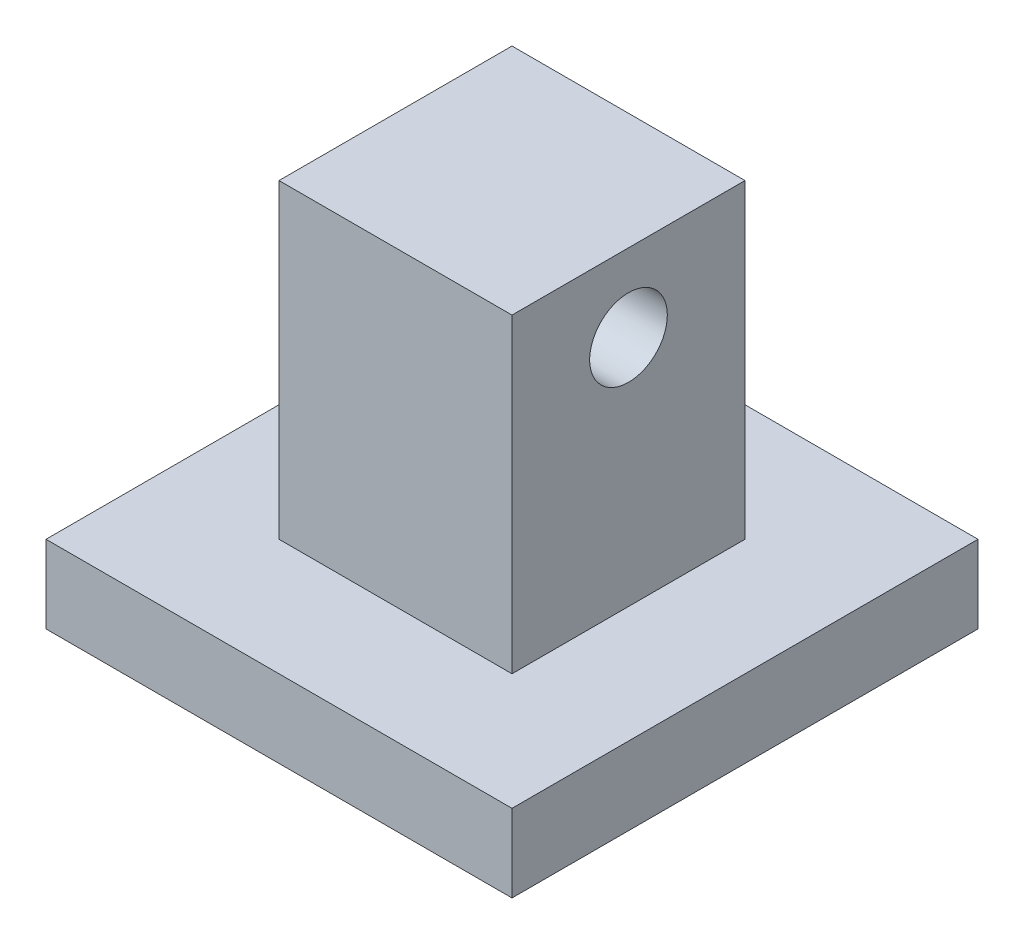
ISO-10303-21;
HEADER;
FILE_DESCRIPTION(('STEP AP214'),'2;1');
FILE_NAME('part.step','',(''),(''),'','','');
FILE_SCHEMA(('AUTOMOTIVE_DESIGN { 1 0 10303 214 1 1 1 1 }'));
ENDSEC;
DATA;
#1=APPLICATION_CONTEXT('core data for automotive mechanical design processes');
#2=APPLICATION_PROTOCOL_DEFINITION('international standard','automotive_design',2000,#1);
#3=PRODUCT_CONTEXT('',#1,'mechanical');
#4=PRODUCT('Part','Part','',(#3));
#5=PRODUCT_RELATED_PRODUCT_CATEGORY('part','',(#4));
#6=PRODUCT_DEFINITION_FORMATION('','',#4);
#7=PRODUCT_DEFINITION_CONTEXT('part definition',#1,'design');
#8=PRODUCT_DEFINITION('design','',#6,#7);
#9=PRODUCT_DEFINITION_SHAPE('','',#8);
#10=(LENGTH_UNIT() NAMED_UNIT(*) SI_UNIT(.MILLI.,.METRE.));
#11=(NAMED_UNIT(*) PLANE_ANGLE_UNIT() SI_UNIT($,.RADIAN.));
#12=(NAMED_UNIT(*) SI_UNIT($,.STERADIAN.) SOLID_ANGLE_UNIT());
#13=UNCERTAINTY_MEASURE_WITH_UNIT(LENGTH_MEASURE(1.E-05),#10,'distance_accuracy_value','');
#14=(GEOMETRIC_REPRESENTATION_CONTEXT(3) GLOBAL_UNCERTAINTY_ASSIGNED_CONTEXT((#13)) GLOBAL_UNIT_ASSIGNED_CONTEXT((#10,
#11,#12)) REPRESENTATION_CONTEXT('',''));
#15=CARTESIAN_POINT('',(0.,0.,0.));
#16=DIRECTION('',(0.,0.,1.));
#17=DIRECTION('',(1.,0.,0.));
#18=AXIS2_PLACEMENT_3D('',#15,#16,#17);
#19=CARTESIAN_POINT('',(76.2,25.4,-76.2));
#20=DIRECTION('',(-1.,0.,0.));
#21=DIRECTION('',(0.,0.,1.));
#22=AXIS2_PLACEMENT_3D('',#19,#20,#21);
#23=PLANE('',#22);
#24=DIRECTION('',(0.,0.,-1.));
#25=VECTOR('',#24,1.);
#26=CARTESIAN_POINT('',(76.2,0.,-76.2));
#27=LINE('',#26,#25);
#28=CARTESIAN_POINT('',(76.2,0.,76.2));
#29=VERTEX_POINT('',#28);
#30=CARTESIAN_POINT('',(76.2,0.,-76.2));
#31=VERTEX_POINT('',#30);
#32=EDGE_CURVE('E127',#29,#31,#27,.T.);
#33=ORIENTED_EDGE('',*,*,#32,.T.);
#34=DIRECTION('',(0.,-1.,0.));
#35=VECTOR('',#34,1.);
#36=CARTESIAN_POINT('',(76.2,25.4,-76.2));
#37=LINE('',#36,#35);
#38=CARTESIAN_POINT('',(76.2,25.4,-76.2));
#39=VERTEX_POINT('',#38);
#40=EDGE_CURVE('E11',#39,#31,#37,.T.);
#41=ORIENTED_EDGE('',*,*,#40,.F.);
#42=DIRECTION('',(0.,0.,-1.));
#43=VECTOR('',#42,1.);
#44=CARTESIAN_POINT('',(76.2,25.4,-76.2));
#45=LINE('',#44,#43);
#46=CARTESIAN_POINT('',(76.2,25.4,76.2));
#47=VERTEX_POINT('',#46);
#48=EDGE_CURVE('E138',#47,#39,#45,.T.);
#49=ORIENTED_EDGE('',*,*,#48,.F.);
#50=DIRECTION('',(0.,-1.,0.));
#51=VECTOR('',#50,1.);
#52=CARTESIAN_POINT('',(76.2,25.4,76.2));
#53=LINE('',#52,#51);
#54=EDGE_CURVE('E151',#47,#29,#53,.T.);
#55=ORIENTED_EDGE('',*,*,#54,.T.);
#56=EDGE_LOOP('',(#33,#41,#49,#55));
#57=FACE_BOUND('',#56,.T.);
#58=ADVANCED_FACE('F39',(#57),#23,.F.);
#59=CARTESIAN_POINT('',(-76.2,25.4,-76.2));
#60=DIRECTION('',(0.,0.,1.));
#61=DIRECTION('',(1.,0.,0.));
#62=AXIS2_PLACEMENT_3D('',#59,#60,#61);
#63=PLANE('',#62);
#64=DIRECTION('',(-1.,0.,0.));
#65=VECTOR('',#64,1.);
#66=CARTESIAN_POINT('',(-76.2,0.,-76.2));
#67=LINE('',#66,#65);
#68=CARTESIAN_POINT('',(-76.2,0.,-76.2));
#69=VERTEX_POINT('',#68);
#70=EDGE_CURVE('E132',#31,#69,#67,.T.);
#71=ORIENTED_EDGE('',*,*,#70,.T.);
#72=DIRECTION('',(0.,-1.,0.));
#73=VECTOR('',#72,1.);
#74=CARTESIAN_POINT('',(-76.2,25.4,-76.2));
#75=LINE('',#74,#73);
#76=CARTESIAN_POINT('',(-76.2,25.4,-76.2));
#77=VERTEX_POINT('',#76);
#78=EDGE_CURVE('E47',#77,#69,#75,.T.);
#79=ORIENTED_EDGE('',*,*,#78,.F.);
#80=DIRECTION('',(-1.,0.,0.));
#81=VECTOR('',#80,1.);
#82=CARTESIAN_POINT('',(-76.2,25.4,-76.2));
#83=LINE('',#82,#81);
#84=EDGE_CURVE('E142',#39,#77,#83,.T.);
#85=ORIENTED_EDGE('',*,*,#84,.F.);
#86=ORIENTED_EDGE('',*,*,#40,.T.);
#87=EDGE_LOOP('',(#71,#79,#85,#86));
#88=FACE_BOUND('',#87,.T.);
#89=ADVANCED_FACE('F188',(#88),#63,.F.);
#90=CARTESIAN_POINT('',(-76.2,25.4,-76.2));
#91=DIRECTION('',(1.,0.,0.));
#92=DIRECTION('',(0.,0.,-1.));
#93=AXIS2_PLACEMENT_3D('',#90,#91,#92);
#94=PLANE('',#93);
#95=DIRECTION('',(0.,0.,1.));
#96=VECTOR('',#95,1.);
#97=CARTESIAN_POINT('',(-76.2,0.,-76.2));
#98=LINE('',#97,#96);
#99=CARTESIAN_POINT('',(-76.2,0.,76.2));
#100=VERTEX_POINT('',#99);
#101=EDGE_CURVE('E155',#69,#100,#98,.T.);
#102=ORIENTED_EDGE('',*,*,#101,.T.);
#103=DIRECTION('',(0.,-1.,0.));
#104=VECTOR('',#103,1.);
#105=CARTESIAN_POINT('',(-76.2,25.4,76.2));
#106=LINE('',#105,#104);
#107=CARTESIAN_POINT('',(-76.2,25.4,76.2));
#108=VERTEX_POINT('',#107);
#109=EDGE_CURVE('E163',#108,#100,#106,.T.);
#110=ORIENTED_EDGE('',*,*,#109,.F.);
#111=DIRECTION('',(0.,0.,1.));
#112=VECTOR('',#111,1.);
#113=CARTESIAN_POINT('',(-76.2,25.4,-76.2));
#114=LINE('',#113,#112);
#115=EDGE_CURVE('E146',#77,#108,#114,.T.);
#116=ORIENTED_EDGE('',*,*,#115,.F.);
#117=ORIENTED_EDGE('',*,*,#78,.T.);
#118=EDGE_LOOP('',(#102,#110,#116,#117));
#119=FACE_BOUND('',#118,.T.);
#120=ADVANCED_FACE('F172',(#119),#94,.F.);
#121=CARTESIAN_POINT('',(-76.2,25.4,76.2));
#122=DIRECTION('',(0.,0.,-1.));
#123=DIRECTION('',(-1.,0.,0.));
#124=AXIS2_PLACEMENT_3D('',#121,#122,#123);
#125=PLANE('',#124);
#126=DIRECTION('',(1.,0.,0.));
#127=VECTOR('',#126,1.);
#128=CARTESIAN_POINT('',(-76.2,0.,76.2));
#129=LINE('',#128,#127);
#130=EDGE_CURVE('E143',#100,#29,#129,.T.);
#131=ORIENTED_EDGE('',*,*,#130,.T.);
#132=ORIENTED_EDGE('',*,*,#54,.F.);
#133=DIRECTION('',(1.,0.,0.));
#134=VECTOR('',#133,1.);
#135=CARTESIAN_POINT('',(-76.2,25.4,76.2));
#136=LINE('',#135,#134);
#137=EDGE_CURVE('E149',#108,#47,#136,.T.);
#138=ORIENTED_EDGE('',*,*,#137,.F.);
#139=ORIENTED_EDGE('',*,*,#109,.T.);
#140=EDGE_LOOP('',(#131,#132,#138,#139));
#141=FACE_BOUND('',#140,.T.);
#142=ADVANCED_FACE('F181',(#141),#125,.F.);
#143=CARTESIAN_POINT('',(0.,25.4,0.));
#144=DIRECTION('',(0.,1.,0.));
#145=DIRECTION('',(0.,0.,1.));
#146=AXIS2_PLACEMENT_3D('',#143,#144,#145);
#147=PLANE('',#146);
#148=DIRECTION('',(0.,0.,-1.));
#149=VECTOR('',#148,1.);
#150=CARTESIAN_POINT('',(38.1,25.4,38.1));
#151=LINE('',#150,#149);
#152=CARTESIAN_POINT('',(38.1,25.4,38.1));
#153=VERTEX_POINT('',#152);
#154=CARTESIAN_POINT('',(38.1,25.4,-38.1));
#155=VERTEX_POINT('',#154);
#156=EDGE_CURVE('E54',#153,#155,#151,.T.);
#157=ORIENTED_EDGE('',*,*,#156,.F.);
#158=DIRECTION('',(1.,0.,0.));
#159=VECTOR('',#158,1.);
#160=CARTESIAN_POINT('',(-38.1,25.4,38.1));
#161=LINE('',#160,#159);
#162=CARTESIAN_POINT('',(-38.1,25.4,38.1));
#163=VERTEX_POINT('',#162);
#164=EDGE_CURVE('E58',#163,#153,#161,.T.);
#165=ORIENTED_EDGE('',*,*,#164,.F.);
#166=DIRECTION('',(0.,0.,1.));
#167=VECTOR('',#166,1.);
#168=CARTESIAN_POINT('',(-38.1,25.4,38.1));
#169=LINE('',#168,#167);
#170=CARTESIAN_POINT('',(-38.1,25.4,-38.1));
#171=VERTEX_POINT('',#170);
#172=EDGE_CURVE('E244',#171,#163,#169,.T.);
#173=ORIENTED_EDGE('',*,*,#172,.F.);
#174=DIRECTION('',(-1.,0.,0.));
#175=VECTOR('',#174,1.);
#176=CARTESIAN_POINT('',(-38.1,25.4,-38.1));
#177=LINE('',#176,#175);
#178=EDGE_CURVE('E233',#155,#171,#177,.T.);
#179=ORIENTED_EDGE('',*,*,#178,.F.);
#180=EDGE_LOOP('',(#157,#165,#173,#179));
#181=FACE_BOUND('',#180,.T.);
#182=ORIENTED_EDGE('',*,*,#48,.T.);
#183=ORIENTED_EDGE('',*,*,#84,.T.);
#184=ORIENTED_EDGE('',*,*,#115,.T.);
#185=ORIENTED_EDGE('',*,*,#137,.T.);
#186=EDGE_LOOP('',(#182,#183,#184,#185));
#187=FACE_BOUND('',#186,.T.);
#188=ADVANCED_FACE('F187',(#181,#187),#147,.T.);
#189=CARTESIAN_POINT('',(0.,0.,0.));
#190=DIRECTION('',(0.,1.,0.));
#191=DIRECTION('',(0.,0.,1.));
#192=AXIS2_PLACEMENT_3D('',#189,#190,#191);
#193=PLANE('',#192);
#194=ORIENTED_EDGE('',*,*,#32,.F.);
#195=ORIENTED_EDGE('',*,*,#130,.F.);
#196=ORIENTED_EDGE('',*,*,#101,.F.);
#197=ORIENTED_EDGE('',*,*,#70,.F.);
#198=EDGE_LOOP('',(#194,#195,#196,#197));
#199=FACE_BOUND('',#198,.T.);
#200=ADVANCED_FACE('F178',(#199),#193,.F.);
#201=CARTESIAN_POINT('',(38.1,127.,38.1));
#202=DIRECTION('',(-1.,0.,0.));
#203=DIRECTION('',(0.,0.,1.));
#204=AXIS2_PLACEMENT_3D('',#201,#202,#203);
#205=PLANE('',#204);
#206=CARTESIAN_POINT('',(38.1,101.6,0.));
#207=DIRECTION('',(1.,0.,0.));
#208=DIRECTION('',(0.,0.,-1.));
#209=AXIS2_PLACEMENT_3D('',#206,#207,#208);
#210=CIRCLE('',#209,12.7);
#211=CARTESIAN_POINT('',(38.1,101.6,-12.7));
#212=VERTEX_POINT('',#211);
#213=EDGE_CURVE('E225',#212,#212,#210,.T.);
#214=ORIENTED_EDGE('',*,*,#213,.F.);
#215=EDGE_LOOP('',(#214));
#216=FACE_BOUND('',#215,.T.);
#217=ORIENTED_EDGE('',*,*,#156,.T.);
#218=DIRECTION('',(0.,-1.,0.));
#219=VECTOR('',#218,1.);
#220=CARTESIAN_POINT('',(38.1,127.,-38.1));
#221=LINE('',#220,#219);
#222=CARTESIAN_POINT('',(38.1,127.,-38.1));
#223=VERTEX_POINT('',#222);
#224=EDGE_CURVE('E107',#223,#155,#221,.T.);
#225=ORIENTED_EDGE('',*,*,#224,.F.);
#226=DIRECTION('',(0.,0.,-1.));
#227=VECTOR('',#226,1.);
#228=CARTESIAN_POINT('',(38.1,127.,38.1));
#229=LINE('',#228,#227);
#230=CARTESIAN_POINT('',(38.1,127.,38.1));
#231=VERTEX_POINT('',#230);
#232=EDGE_CURVE('E114',#231,#223,#229,.T.);
#233=ORIENTED_EDGE('',*,*,#232,.F.);
#234=DIRECTION('',(0.,-1.,0.));
#235=VECTOR('',#234,1.);
#236=CARTESIAN_POINT('',(38.1,127.,38.1));
#237=LINE('',#236,#235);
#238=EDGE_CURVE('E240',#231,#153,#237,.T.);
#239=ORIENTED_EDGE('',*,*,#238,.T.);
#240=EDGE_LOOP('',(#217,#225,#233,#239));
#241=FACE_BOUND('',#240,.T.);
#242=ADVANCED_FACE('F125',(#216,#241),#205,.F.);
#243=CARTESIAN_POINT('',(-38.1,127.,-38.1));
#244=DIRECTION('',(0.,0.,1.));
#245=DIRECTION('',(1.,0.,0.));
#246=AXIS2_PLACEMENT_3D('',#243,#244,#245);
#247=PLANE('',#246);
#248=ORIENTED_EDGE('',*,*,#178,.T.);
#249=DIRECTION('',(0.,-1.,0.));
#250=VECTOR('',#249,1.);
#251=CARTESIAN_POINT('',(-38.1,127.,-38.1));
#252=LINE('',#251,#250);
#253=CARTESIAN_POINT('',(-38.1,127.,-38.1));
#254=VERTEX_POINT('',#253);
#255=EDGE_CURVE('E109',#254,#171,#252,.T.);
#256=ORIENTED_EDGE('',*,*,#255,.F.);
#257=DIRECTION('',(-1.,0.,0.));
#258=VECTOR('',#257,1.);
#259=CARTESIAN_POINT('',(-38.1,127.,-38.1));
#260=LINE('',#259,#258);
#261=EDGE_CURVE('E102',#223,#254,#260,.T.);
#262=ORIENTED_EDGE('',*,*,#261,.F.);
#263=ORIENTED_EDGE('',*,*,#224,.T.);
#264=EDGE_LOOP('',(#248,#256,#262,#263));
#265=FACE_BOUND('',#264,.T.);
#266=ADVANCED_FACE('F105',(#265),#247,.F.);
#267=CARTESIAN_POINT('',(-38.1,127.,38.1));
#268=DIRECTION('',(1.,0.,0.));
#269=DIRECTION('',(0.,0.,-1.));
#270=AXIS2_PLACEMENT_3D('',#267,#268,#269);
#271=PLANE('',#270);
#272=CARTESIAN_POINT('',(-38.1,101.6,0.));
#273=DIRECTION('',(1.,0.,0.));
#274=DIRECTION('',(0.,0.,-1.));
#275=AXIS2_PLACEMENT_3D('',#272,#273,#274);
#276=CIRCLE('',#275,12.7);
#277=CARTESIAN_POINT('',(-38.1,101.6,-12.7));
#278=VERTEX_POINT('',#277);
#279=EDGE_CURVE('E228',#278,#278,#276,.F.);
#280=ORIENTED_EDGE('',*,*,#279,.F.);
#281=EDGE_LOOP('',(#280));
#282=FACE_BOUND('',#281,.T.);
#283=ORIENTED_EDGE('',*,*,#172,.T.);
#284=DIRECTION('',(0.,-1.,0.));
#285=VECTOR('',#284,1.);
#286=CARTESIAN_POINT('',(-38.1,127.,38.1));
#287=LINE('',#286,#285);
#288=CARTESIAN_POINT('',(-38.1,127.,38.1));
#289=VERTEX_POINT('',#288);
#290=EDGE_CURVE('E134',#289,#163,#287,.T.);
#291=ORIENTED_EDGE('',*,*,#290,.F.);
#292=DIRECTION('',(0.,0.,1.));
#293=VECTOR('',#292,1.);
#294=CARTESIAN_POINT('',(-38.1,127.,38.1));
#295=LINE('',#294,#293);
#296=EDGE_CURVE('E113',#254,#289,#295,.T.);
#297=ORIENTED_EDGE('',*,*,#296,.F.);
#298=ORIENTED_EDGE('',*,*,#255,.T.);
#299=EDGE_LOOP('',(#283,#291,#297,#298));
#300=FACE_BOUND('',#299,.T.);
#301=ADVANCED_FACE('F207',(#282,#300),#271,.F.);
#302=CARTESIAN_POINT('',(-38.1,127.,38.1));
#303=DIRECTION('',(0.,0.,-1.));
#304=DIRECTION('',(-1.,0.,0.));
#305=AXIS2_PLACEMENT_3D('',#302,#303,#304);
#306=PLANE('',#305);
#307=ORIENTED_EDGE('',*,*,#164,.T.);
#308=ORIENTED_EDGE('',*,*,#238,.F.);
#309=DIRECTION('',(1.,0.,0.));
#310=VECTOR('',#309,1.);
#311=CARTESIAN_POINT('',(-38.1,127.,38.1));
#312=LINE('',#311,#310);
#313=EDGE_CURVE('E119',#289,#231,#312,.T.);
#314=ORIENTED_EDGE('',*,*,#313,.F.);
#315=ORIENTED_EDGE('',*,*,#290,.T.);
#316=EDGE_LOOP('',(#307,#308,#314,#315));
#317=FACE_BOUND('',#316,.T.);
#318=ADVANCED_FACE('F210',(#317),#306,.F.);
#319=CARTESIAN_POINT('',(0.,127.,0.));
#320=DIRECTION('',(0.,-1.,0.));
#321=DIRECTION('',(0.,0.,-1.));
#322=AXIS2_PLACEMENT_3D('',#319,#320,#321);
#323=PLANE('',#322);
#324=ORIENTED_EDGE('',*,*,#232,.T.);
#325=ORIENTED_EDGE('',*,*,#261,.T.);
#326=ORIENTED_EDGE('',*,*,#296,.T.);
#327=ORIENTED_EDGE('',*,*,#313,.T.);
#328=EDGE_LOOP('',(#324,#325,#326,#327));
#329=FACE_BOUND('',#328,.T.);
#330=ADVANCED_FACE('F117',(#329),#323,.F.);
#331=CARTESIAN_POINT('',(-76.201,101.6,0.));
#332=DIRECTION('',(1.,0.,0.));
#333=DIRECTION('',(0.,0.,-1.));
#334=AXIS2_PLACEMENT_3D('',#331,#332,#333);
#335=CYLINDRICAL_SURFACE('',#334,12.7);
#336=CARTESIAN_POINT('',(38.1,101.6,-12.7));
#337=CARTESIAN_POINT('',(37.30625,101.6,-12.7));
#338=CARTESIAN_POINT('',(36.5125,101.6,-12.7));
#339=CARTESIAN_POINT('',(34.925,101.6,-12.7));
#340=CARTESIAN_POINT('',(34.13125,101.6,-12.7));
#341=CARTESIAN_POINT('',(32.54375,101.6,-12.7));
#342=CARTESIAN_POINT('',(31.75,101.6,-12.7));
#343=CARTESIAN_POINT('',(30.1625,101.6,-12.7));
#344=CARTESIAN_POINT('',(29.36875,101.6,-12.7));
#345=CARTESIAN_POINT('',(27.78125,101.6,-12.7));
#346=CARTESIAN_POINT('',(26.9875,101.6,-12.7));
#347=CARTESIAN_POINT('',(25.4,101.6,-12.7));
#348=CARTESIAN_POINT('',(24.60625,101.6,-12.7));
#349=CARTESIAN_POINT('',(23.01875,101.6,-12.7));
#350=CARTESIAN_POINT('',(22.225,101.6,-12.7));
#351=CARTESIAN_POINT('',(20.6375,101.6,-12.7));
#352=CARTESIAN_POINT('',(19.84375,101.6,-12.7));
#353=CARTESIAN_POINT('',(18.25625,101.6,-12.7));
#354=CARTESIAN_POINT('',(17.4625,101.6,-12.7));
#355=CARTESIAN_POINT('',(15.875,101.6,-12.7));
#356=CARTESIAN_POINT('',(15.08125,101.6,-12.7));
#357=CARTESIAN_POINT('',(13.49375,101.6,-12.7));
#358=CARTESIAN_POINT('',(12.7,101.6,-12.7));
#359=CARTESIAN_POINT('',(11.1125,101.6,-12.7));
#360=CARTESIAN_POINT('',(10.31875,101.6,-12.7));
#361=CARTESIAN_POINT('',(8.73125,101.6,-12.7));
#362=CARTESIAN_POINT('',(7.93750000000001,101.6,-12.7));
#363=CARTESIAN_POINT('',(6.35,101.6,-12.7));
#364=CARTESIAN_POINT('',(5.55625,101.6,-12.7));
#365=CARTESIAN_POINT('',(3.96875,101.6,-12.7));
#366=CARTESIAN_POINT('',(3.175,101.6,-12.7));
#367=CARTESIAN_POINT('',(1.5875,101.6,-12.7));
#368=CARTESIAN_POINT('',(0.793750000000001,101.6,-12.7));
#369=CARTESIAN_POINT('',(-0.793750000000001,101.6,-12.7));
#370=CARTESIAN_POINT('',(-1.5875,101.6,-12.7));
#371=CARTESIAN_POINT('',(-3.175,101.6,-12.7));
#372=CARTESIAN_POINT('',(-3.96875,101.6,-12.7));
#373=CARTESIAN_POINT('',(-5.55625,101.6,-12.7));
#374=CARTESIAN_POINT('',(-6.35,101.6,-12.7));
#375=CARTESIAN_POINT('',(-7.93750000000001,101.6,-12.7));
#376=CARTESIAN_POINT('',(-8.73125,101.6,-12.7));
#377=CARTESIAN_POINT('',(-10.31875,101.6,-12.7));
#378=CARTESIAN_POINT('',(-11.1125,101.6,-12.7));
#379=CARTESIAN_POINT('',(-12.7,101.6,-12.7));
#380=CARTESIAN_POINT('',(-13.49375,101.6,-12.7));
#381=CARTESIAN_POINT('',(-15.08125,101.6,-12.7));
#382=CARTESIAN_POINT('',(-15.875,101.6,-12.7));
#383=CARTESIAN_POINT('',(-17.4625,101.6,-12.7));
#384=CARTESIAN_POINT('',(-18.25625,101.6,-12.7));
#385=CARTESIAN_POINT('',(-19.84375,101.6,-12.7));
#386=CARTESIAN_POINT('',(-20.6375,101.6,-12.7));
#387=CARTESIAN_POINT('',(-22.225,101.6,-12.7));
#388=CARTESIAN_POINT('',(-23.01875,101.6,-12.7));
#389=CARTESIAN_POINT('',(-24.60625,101.6,-12.7));
#390=CARTESIAN_POINT('',(-25.4,101.6,-12.7));
#391=CARTESIAN_POINT('',(-26.9875,101.6,-12.7));
#392=CARTESIAN_POINT('',(-27.78125,101.6,-12.7));
#393=CARTESIAN_POINT('',(-29.36875,101.6,-12.7));
#394=CARTESIAN_POINT('',(-30.1625,101.6,-12.7));
#395=CARTESIAN_POINT('',(-31.75,101.6,-12.7));
#396=CARTESIAN_POINT('',(-32.54375,101.6,-12.7));
#397=CARTESIAN_POINT('',(-34.13125,101.6,-12.7));
#398=CARTESIAN_POINT('',(-34.925,101.6,-12.7));
#399=CARTESIAN_POINT('',(-36.5125,101.6,-12.7));
#400=CARTESIAN_POINT('',(-37.30625,101.6,-12.7));
#401=CARTESIAN_POINT('',(-38.1,101.6,-12.7));
#402=B_SPLINE_CURVE_WITH_KNOTS('',3,(#336,#337,#338,#339,#340,#341,#342,#343,#344,#345,#346,
#347,#348,#349,#350,#351,#352,#353,#354,#355,#356,#357,#358,#359,#360,#361,#362,#363,#364,#365,
#366,#367,#368,#369,#370,#371,#372,#373,#374,#375,#376,#377,#378,#379,#380,#381,#382,#383,#384,
#385,#386,#387,#388,#389,#390,#391,#392,#393,#394,#395,#396,#397,#398,#399,#400,#401),
.UNSPECIFIED.,.F.,.F.,(4,2,2,2,2,2,2,2,2,2,2,2,2,2,2,2,2,2,2,2,2,2,2,2,2,2,2,2,2,2,2,2,4),(0.,
2.38125,4.7625,7.14375,9.52500000000001,11.90625,14.2875,16.66875,19.05,21.43125,23.8125,
26.19375,28.575,30.95625,33.3375,35.71875,38.1,40.48125,42.8625,45.24375,47.625,50.00625,
52.3875,54.76875,57.15,59.53125,61.9125,64.29375,66.675,69.05625,71.4375,73.81875,76.2),.UNSPECIFIED.);
#403=EDGE_CURVE('BSEAM217',#212,#278,#402,.T.);
#404=ORIENTED_EDGE('',*,*,#213,.T.);
#405=ORIENTED_EDGE('',*,*,#279,.T.);
#406=ORIENTED_EDGE('',*,*,#403,.T.);
#407=ORIENTED_EDGE('',*,*,#403,.F.);
#408=EDGE_LOOP('',(#404,#406,#405,#407));
#409=FACE_BOUND('',#408,.T.);
#410=ADVANCED_FACE('F217',(#409),#335,.F.);
#411=CLOSED_SHELL('',(#58,#89,#120,#142,#188,#200,#242,#266,#301,#318,#330,#410));
#412=MANIFOLD_SOLID_BREP('B2',#411);
#413=ADVANCED_BREP_SHAPE_REPRESENTATION('',(#18,#412),#14);
#414=SHAPE_DEFINITION_REPRESENTATION(#9,#413);
ENDSEC;
END-ISO-10303-21;
